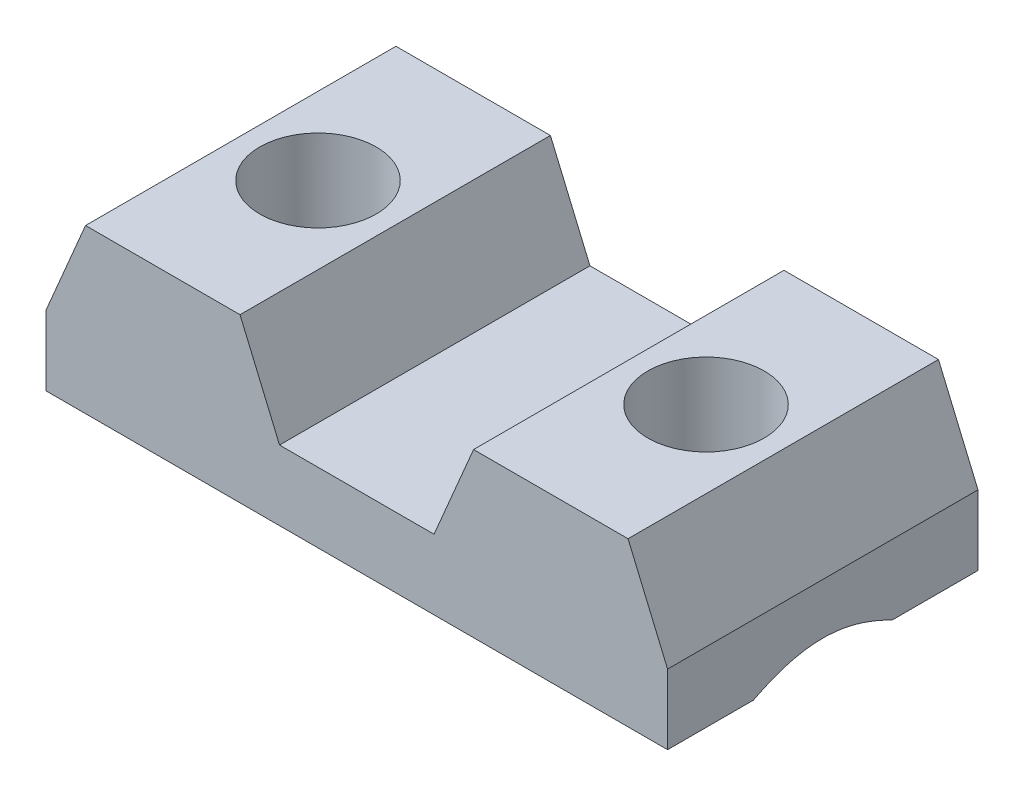
ISO-10303-21;
HEADER;
FILE_DESCRIPTION(('STEP AP214'),'2;1');
FILE_NAME('part.step','',(''),(''),'','','');
FILE_SCHEMA(('AUTOMOTIVE_DESIGN { 1 0 10303 214 1 1 1 1 }'));
ENDSEC;
DATA;
#1=APPLICATION_CONTEXT('core data for automotive mechanical design processes');
#2=APPLICATION_PROTOCOL_DEFINITION('international standard','automotive_design',2000,#1);
#3=PRODUCT_CONTEXT('',#1,'mechanical');
#4=PRODUCT('Part','Part','',(#3));
#5=PRODUCT_RELATED_PRODUCT_CATEGORY('part','',(#4));
#6=PRODUCT_DEFINITION_FORMATION('','',#4);
#7=PRODUCT_DEFINITION_CONTEXT('part definition',#1,'design');
#8=PRODUCT_DEFINITION('design','',#6,#7);
#9=PRODUCT_DEFINITION_SHAPE('','',#8);
#10=(LENGTH_UNIT() NAMED_UNIT(*) SI_UNIT(.MILLI.,.METRE.));
#11=(NAMED_UNIT(*) PLANE_ANGLE_UNIT() SI_UNIT($,.RADIAN.));
#12=(NAMED_UNIT(*) SI_UNIT($,.STERADIAN.) SOLID_ANGLE_UNIT());
#13=UNCERTAINTY_MEASURE_WITH_UNIT(LENGTH_MEASURE(1.E-05),#10,'distance_accuracy_value','');
#14=(GEOMETRIC_REPRESENTATION_CONTEXT(3) GLOBAL_UNCERTAINTY_ASSIGNED_CONTEXT((#13)) GLOBAL_UNIT_ASSIGNED_CONTEXT((#10,
#11,#12)) REPRESENTATION_CONTEXT('',''));
#15=CARTESIAN_POINT('',(0.,0.,0.));
#16=DIRECTION('',(0.,0.,1.));
#17=DIRECTION('',(1.,0.,0.));
#18=AXIS2_PLACEMENT_3D('',#15,#16,#17);
#19=CARTESIAN_POINT('',(6.99063022054847,0.,8.));
#20=DIRECTION('',(-0.92050485345244,-0.390731128489275,0.));
#21=DIRECTION('',(0.390731128489275,-0.92050485345244,0.));
#22=AXIS2_PLACEMENT_3D('',#19,#20,#21);
#23=PLANE('',#22);
#24=DIRECTION('',(-0.390731128489275,0.92050485345244,0.));
#25=VECTOR('',#24,1.);
#26=CARTESIAN_POINT('',(6.99063022054847,0.,0.));
#27=LINE('',#26,#25);
#28=CARTESIAN_POINT('',(8.00936977945153,-2.4,0.));
#29=VERTEX_POINT('',#28);
#30=CARTESIAN_POINT('',(6.99063022054847,0.,0.));
#31=VERTEX_POINT('',#30);
#32=EDGE_CURVE('E146',#29,#31,#27,.T.);
#33=ORIENTED_EDGE('',*,*,#32,.T.);
#34=DIRECTION('',(0.,0.,-1.));
#35=VECTOR('',#34,1.);
#36=CARTESIAN_POINT('',(6.99063022054847,0.,8.));
#37=LINE('',#36,#35);
#38=CARTESIAN_POINT('',(6.99063022054847,0.,8.));
#39=VERTEX_POINT('',#38);
#40=EDGE_CURVE('E127',#39,#31,#37,.T.);
#41=ORIENTED_EDGE('',*,*,#40,.F.);
#42=DIRECTION('',(-0.390731128489275,0.92050485345244,0.));
#43=VECTOR('',#42,1.);
#44=CARTESIAN_POINT('',(6.99063022054847,0.,8.));
#45=LINE('',#44,#43);
#46=CARTESIAN_POINT('',(8.00936977945153,-2.4,8.));
#47=VERTEX_POINT('',#46);
#48=EDGE_CURVE('E134',#47,#39,#45,.T.);
#49=ORIENTED_EDGE('',*,*,#48,.F.);
#50=DIRECTION('',(0.,0.,-1.));
#51=VECTOR('',#50,1.);
#52=CARTESIAN_POINT('',(8.00936977945153,-2.4,8.));
#53=LINE('',#52,#51);
#54=EDGE_CURVE('E330',#47,#29,#53,.T.);
#55=ORIENTED_EDGE('',*,*,#54,.T.);
#56=EDGE_LOOP('',(#33,#41,#49,#55));
#57=FACE_BOUND('',#56,.T.);
#58=ADVANCED_FACE('F33',(#57),#23,.F.);
#59=CARTESIAN_POINT('',(6.99063022054847,0.,8.));
#60=DIRECTION('',(0.,-1.,0.));
#61=DIRECTION('',(1.,0.,0.));
#62=AXIS2_PLACEMENT_3D('',#59,#60,#61);
#63=PLANE('',#62);
#64=CARTESIAN_POINT('',(5.,0.,4.));
#65=DIRECTION('',(0.,1.,0.));
#66=DIRECTION('',(-1.,0.,0.));
#67=AXIS2_PLACEMENT_3D('',#64,#65,#66);
#68=CIRCLE('',#67,1.5);
#69=CARTESIAN_POINT('',(3.5,0.,4.));
#70=VERTEX_POINT('',#69);
#71=EDGE_CURVE('E376',#70,#70,#68,.T.);
#72=ORIENTED_EDGE('',*,*,#71,.F.);
#73=EDGE_LOOP('',(#72));
#74=FACE_BOUND('',#73,.T.);
#75=DIRECTION('',(-1.,0.,0.));
#76=VECTOR('',#75,1.);
#77=CARTESIAN_POINT('',(6.99063022054847,0.,0.));
#78=LINE('',#77,#76);
#79=CARTESIAN_POINT('',(3.00936977945153,0.,0.));
#80=VERTEX_POINT('',#79);
#81=EDGE_CURVE('E360',#31,#80,#78,.T.);
#82=ORIENTED_EDGE('',*,*,#81,.T.);
#83=DIRECTION('',(0.,0.,-1.));
#84=VECTOR('',#83,1.);
#85=CARTESIAN_POINT('',(3.00936977945153,0.,8.));
#86=LINE('',#85,#84);
#87=CARTESIAN_POINT('',(3.00936977945153,0.,8.));
#88=VERTEX_POINT('',#87);
#89=EDGE_CURVE('E130',#88,#80,#86,.T.);
#90=ORIENTED_EDGE('',*,*,#89,.F.);
#91=DIRECTION('',(-1.,0.,0.));
#92=VECTOR('',#91,1.);
#93=CARTESIAN_POINT('',(6.99063022054847,0.,8.));
#94=LINE('',#93,#92);
#95=EDGE_CURVE('E123',#39,#88,#94,.T.);
#96=ORIENTED_EDGE('',*,*,#95,.F.);
#97=ORIENTED_EDGE('',*,*,#40,.T.);
#98=EDGE_LOOP('',(#82,#90,#96,#97));
#99=FACE_BOUND('',#98,.T.);
#100=ADVANCED_FACE('F125',(#74,#99),#63,.F.);
#101=CARTESIAN_POINT('',(3.00936977945153,0.,8.));
#102=DIRECTION('',(0.92050485345244,-0.390731128489275,0.));
#103=DIRECTION('',(0.390731128489275,0.92050485345244,0.));
#104=AXIS2_PLACEMENT_3D('',#101,#102,#103);
#105=PLANE('',#104);
#106=DIRECTION('',(-0.390731128489275,-0.92050485345244,0.));
#107=VECTOR('',#106,1.);
#108=CARTESIAN_POINT('',(3.00936977945153,0.,0.));
#109=LINE('',#108,#107);
#110=CARTESIAN_POINT('',(1.99063022054847,-2.4,0.));
#111=VERTEX_POINT('',#110);
#112=EDGE_CURVE('E354',#80,#111,#109,.T.);
#113=ORIENTED_EDGE('',*,*,#112,.T.);
#114=DIRECTION('',(0.,0.,-1.));
#115=VECTOR('',#114,1.);
#116=CARTESIAN_POINT('',(1.99063022054847,-2.4,8.));
#117=LINE('',#116,#115);
#118=CARTESIAN_POINT('',(1.99063022054847,-2.4,8.));
#119=VERTEX_POINT('',#118);
#120=EDGE_CURVE('E152',#119,#111,#117,.T.);
#121=ORIENTED_EDGE('',*,*,#120,.F.);
#122=DIRECTION('',(-0.390731128489275,-0.92050485345244,0.));
#123=VECTOR('',#122,1.);
#124=CARTESIAN_POINT('',(3.00936977945153,0.,8.));
#125=LINE('',#124,#123);
#126=EDGE_CURVE('E133',#88,#119,#125,.T.);
#127=ORIENTED_EDGE('',*,*,#126,.F.);
#128=ORIENTED_EDGE('',*,*,#89,.T.);
#129=EDGE_LOOP('',(#113,#121,#127,#128));
#130=FACE_BOUND('',#129,.T.);
#131=ADVANCED_FACE('F189',(#130),#105,.F.);
#132=CARTESIAN_POINT('',(-1.99063022054847,-2.4,8.));
#133=DIRECTION('',(0.,-1.,0.));
#134=DIRECTION('',(0.,0.,-1.));
#135=AXIS2_PLACEMENT_3D('',#132,#133,#134);
#136=PLANE('',#135);
#137=DIRECTION('',(-1.,0.,0.));
#138=VECTOR('',#137,1.);
#139=CARTESIAN_POINT('',(-1.99063022054847,-2.4,0.));
#140=LINE('',#139,#138);
#141=CARTESIAN_POINT('',(-1.99063022054847,-2.4,0.));
#142=VERTEX_POINT('',#141);
#143=EDGE_CURVE('E350',#111,#142,#140,.T.);
#144=ORIENTED_EDGE('',*,*,#143,.T.);
#145=DIRECTION('',(0.,0.,-1.));
#146=VECTOR('',#145,1.);
#147=CARTESIAN_POINT('',(-1.99063022054847,-2.4,8.));
#148=LINE('',#147,#146);
#149=CARTESIAN_POINT('',(-1.99063022054847,-2.4,8.));
#150=VERTEX_POINT('',#149);
#151=EDGE_CURVE('E343',#150,#142,#148,.T.);
#152=ORIENTED_EDGE('',*,*,#151,.F.);
#153=DIRECTION('',(-1.,0.,0.));
#154=VECTOR('',#153,1.);
#155=CARTESIAN_POINT('',(-1.99063022054847,-2.4,8.));
#156=LINE('',#155,#154);
#157=EDGE_CURVE('E351',#119,#150,#156,.T.);
#158=ORIENTED_EDGE('',*,*,#157,.F.);
#159=ORIENTED_EDGE('',*,*,#120,.T.);
#160=EDGE_LOOP('',(#144,#152,#158,#159));
#161=FACE_BOUND('',#160,.T.);
#162=ADVANCED_FACE('F185',(#161),#136,.F.);
#163=CARTESIAN_POINT('',(-3.00936977945153,0.,8.));
#164=DIRECTION('',(-0.92050485345244,-0.390731128489275,0.));
#165=DIRECTION('',(0.390731128489275,-0.92050485345244,0.));
#166=AXIS2_PLACEMENT_3D('',#163,#164,#165);
#167=PLANE('',#166);
#168=DIRECTION('',(-0.390731128489275,0.92050485345244,0.));
#169=VECTOR('',#168,1.);
#170=CARTESIAN_POINT('',(-3.00936977945153,0.,0.));
#171=LINE('',#170,#169);
#172=CARTESIAN_POINT('',(-3.00936977945153,0.,0.));
#173=VERTEX_POINT('',#172);
#174=EDGE_CURVE('E356',#142,#173,#171,.T.);
#175=ORIENTED_EDGE('',*,*,#174,.T.);
#176=DIRECTION('',(0.,0.,-1.));
#177=VECTOR('',#176,1.);
#178=CARTESIAN_POINT('',(-3.00936977945153,0.,8.));
#179=LINE('',#178,#177);
#180=CARTESIAN_POINT('',(-3.00936977945153,0.,8.));
#181=VERTEX_POINT('',#180);
#182=EDGE_CURVE('E340',#181,#173,#179,.T.);
#183=ORIENTED_EDGE('',*,*,#182,.F.);
#184=DIRECTION('',(-0.390731128489275,0.92050485345244,0.));
#185=VECTOR('',#184,1.);
#186=CARTESIAN_POINT('',(-3.00936977945153,0.,8.));
#187=LINE('',#186,#185);
#188=EDGE_CURVE('E388',#150,#181,#187,.T.);
#189=ORIENTED_EDGE('',*,*,#188,.F.);
#190=ORIENTED_EDGE('',*,*,#151,.T.);
#191=EDGE_LOOP('',(#175,#183,#189,#190));
#192=FACE_BOUND('',#191,.T.);
#193=ADVANCED_FACE('F181',(#192),#167,.F.);
#194=CARTESIAN_POINT('',(-6.99063022054847,0.,8.));
#195=DIRECTION('',(0.,-1.,0.));
#196=DIRECTION('',(1.,0.,0.));
#197=AXIS2_PLACEMENT_3D('',#194,#195,#196);
#198=PLANE('',#197);
#199=CARTESIAN_POINT('',(-5.,0.,4.));
#200=DIRECTION('',(0.,1.,0.));
#201=DIRECTION('',(-1.,0.,0.));
#202=AXIS2_PLACEMENT_3D('',#199,#200,#201);
#203=CIRCLE('',#202,1.5);
#204=CARTESIAN_POINT('',(-6.5,0.,4.));
#205=VERTEX_POINT('',#204);
#206=EDGE_CURVE('E373',#205,#205,#203,.T.);
#207=ORIENTED_EDGE('',*,*,#206,.F.);
#208=EDGE_LOOP('',(#207));
#209=FACE_BOUND('',#208,.T.);
#210=DIRECTION('',(-1.,0.,0.));
#211=VECTOR('',#210,1.);
#212=CARTESIAN_POINT('',(-6.99063022054847,0.,0.));
#213=LINE('',#212,#211);
#214=CARTESIAN_POINT('',(-6.99063022054847,0.,0.));
#215=VERTEX_POINT('',#214);
#216=EDGE_CURVE('E358',#173,#215,#213,.T.);
#217=ORIENTED_EDGE('',*,*,#216,.T.);
#218=DIRECTION('',(0.,0.,-1.));
#219=VECTOR('',#218,1.);
#220=CARTESIAN_POINT('',(-6.99063022054847,0.,8.));
#221=LINE('',#220,#219);
#222=CARTESIAN_POINT('',(-6.99063022054847,0.,8.));
#223=VERTEX_POINT('',#222);
#224=EDGE_CURVE('E337',#223,#215,#221,.T.);
#225=ORIENTED_EDGE('',*,*,#224,.F.);
#226=DIRECTION('',(-1.,0.,0.));
#227=VECTOR('',#226,1.);
#228=CARTESIAN_POINT('',(-6.99063022054847,0.,8.));
#229=LINE('',#228,#227);
#230=EDGE_CURVE('E386',#181,#223,#229,.T.);
#231=ORIENTED_EDGE('',*,*,#230,.F.);
#232=ORIENTED_EDGE('',*,*,#182,.T.);
#233=EDGE_LOOP('',(#217,#225,#231,#232));
#234=FACE_BOUND('',#233,.T.);
#235=ADVANCED_FACE('F177',(#209,#234),#198,.F.);
#236=CARTESIAN_POINT('',(-6.99063022054847,0.,8.));
#237=DIRECTION('',(0.92050485345244,-0.390731128489275,0.));
#238=DIRECTION('',(0.390731128489275,0.92050485345244,0.));
#239=AXIS2_PLACEMENT_3D('',#236,#237,#238);
#240=PLANE('',#239);
#241=DIRECTION('',(-0.390731128489275,-0.92050485345244,0.));
#242=VECTOR('',#241,1.);
#243=CARTESIAN_POINT('',(-6.99063022054847,0.,0.));
#244=LINE('',#243,#242);
#245=CARTESIAN_POINT('',(-8.00936977945153,-2.4,0.));
#246=VERTEX_POINT('',#245);
#247=EDGE_CURVE('E365',#215,#246,#244,.T.);
#248=ORIENTED_EDGE('',*,*,#247,.T.);
#249=DIRECTION('',(0.,0.,-1.));
#250=VECTOR('',#249,1.);
#251=CARTESIAN_POINT('',(-8.00936977945153,-2.4,8.));
#252=LINE('',#251,#250);
#253=CARTESIAN_POINT('',(-8.00936977945153,-2.4,8.));
#254=VERTEX_POINT('',#253);
#255=EDGE_CURVE('E334',#254,#246,#252,.T.);
#256=ORIENTED_EDGE('',*,*,#255,.F.);
#257=DIRECTION('',(-0.390731128489275,-0.92050485345244,0.));
#258=VECTOR('',#257,1.);
#259=CARTESIAN_POINT('',(-6.99063022054847,0.,8.));
#260=LINE('',#259,#258);
#261=EDGE_CURVE('E384',#223,#254,#260,.T.);
#262=ORIENTED_EDGE('',*,*,#261,.F.);
#263=ORIENTED_EDGE('',*,*,#224,.T.);
#264=EDGE_LOOP('',(#248,#256,#262,#263));
#265=FACE_BOUND('',#264,.T.);
#266=ADVANCED_FACE('F173',(#265),#240,.F.);
#267=CARTESIAN_POINT('',(-8.00936977945153,-2.4,8.));
#268=DIRECTION('',(1.,0.,0.));
#269=DIRECTION('',(0.,0.,-1.));
#270=AXIS2_PLACEMENT_3D('',#267,#268,#269);
#271=PLANE('',#270);
#272=DIRECTION('',(0.,0.,-1.));
#273=VECTOR('',#272,1.);
#274=CARTESIAN_POINT('',(-8.00936977945153,-4.2,8.));
#275=LINE('',#274,#273);
#276=CARTESIAN_POINT('',(-8.00936977945153,-4.2,2.21290919913849));
#277=VERTEX_POINT('',#276);
#278=CARTESIAN_POINT('',(-8.00936977945153,-4.2,0.));
#279=VERTEX_POINT('',#278);
#280=EDGE_CURVE('E326',#277,#279,#275,.T.);
#281=ORIENTED_EDGE('',*,*,#280,.F.);
#282=CARTESIAN_POINT('',(-8.00936977945153,-4.2,2.21290919913849));
#283=CARTESIAN_POINT('',(-8.00936977945153,-4.16871578945284,2.27419074035915));
#284=CARTESIAN_POINT('',(-8.00936977945153,-4.13836625380984,2.33594847393503));
#285=CARTESIAN_POINT('',(-8.00936977945153,-4.07983181141081,2.46052237973463));
#286=CARTESIAN_POINT('',(-8.00936977945153,-4.05164814874477,2.52333913537894));
#287=CARTESIAN_POINT('',(-8.00936977945153,-3.97052428689372,2.71417802832816));
#288=CARTESIAN_POINT('',(-8.00936977945153,-3.92138752017952,2.84386819249786));
#289=CARTESIAN_POINT('',(-8.00936977945153,-3.83713592617526,3.10537588465967));
#290=CARTESIAN_POINT('',(-8.00936977945153,-3.80179696949844,3.23711978979554));
#291=CARTESIAN_POINT('',(-8.00936977945153,-3.74725542080623,3.50366615939376));
#292=CARTESIAN_POINT('',(-8.00936977945153,-3.72800885781087,3.63845924895136));
#293=CARTESIAN_POINT('',(-8.00936977945153,-3.71077428234083,3.86826941194748));
#294=CARTESIAN_POINT('',(-8.00936977945153,-3.70810906884971,3.96295085378222));
#295=CARTESIAN_POINT('',(-8.00936977945153,-3.71173162083696,4.15218403606616));
#296=CARTESIAN_POINT('',(-8.00936977945153,-3.71802265899547,4.24673571646074));
#297=CARTESIAN_POINT('',(-8.00936977945153,-3.73920010439786,4.4349693278625));
#298=CARTESIAN_POINT('',(-8.00936977945153,-3.7540970671054,4.52865004697143));
#299=CARTESIAN_POINT('',(-8.00936977945153,-3.79166769487479,4.71441014110962));
#300=CARTESIAN_POINT('',(-8.00936977945153,-3.81434079415145,4.8064896321309));
#301=CARTESIAN_POINT('',(-8.00936977945153,-3.86242127288549,4.97471587849637));
#302=CARTESIAN_POINT('',(-8.00936977945153,-3.88687562102531,5.05113986599515));
#303=CARTESIAN_POINT('',(-8.00936977945153,-3.93996115709255,5.20252494823962));
#304=CARTESIAN_POINT('',(-8.00936977945153,-3.96859280917031,5.27748587937082));
#305=CARTESIAN_POINT('',(-8.00936977945153,-4.0293268441301,5.42571923174706));
#306=CARTESIAN_POINT('',(-8.00936977945153,-4.06141884098988,5.49899594682528));
#307=CARTESIAN_POINT('',(-8.00936977945153,-4.12859340955563,5.64409815306972));
#308=CARTESIAN_POINT('',(-8.00936977945153,-4.16367356629317,5.71592475918171));
#309=CARTESIAN_POINT('',(-8.00936977945153,-4.2,5.78709080086151));
#310=B_SPLINE_CURVE_WITH_KNOTS('',3,(#282,#283,#284,#285,#286,#287,#288,#289,#290,#291,#292,
#293,#294,#295,#296,#297,#298,#299,#300,#301,#302,#303,#304,#305,#306,#307,#308,#309),
.UNSPECIFIED.,.F.,.F.,(4,2,2,2,2,2,2,2,2,2,2,2,2,4),(0.,0.206399371443589,0.412916427220919,
0.828383439136866,1.23678896019127,1.64407486985018,1.92783134122069,2.2116915259072,
2.49590061635695,2.78008903237592,3.02068120509467,3.26130013098036,3.5012159625855,
3.74093970617943),.UNSPECIFIED.);
#311=CARTESIAN_POINT('',(-8.00936977945153,-4.2,5.78709080086151));
#312=VERTEX_POINT('',#311);
#313=EDGE_CURVE('E48',#277,#312,#310,.T.);
#314=ORIENTED_EDGE('',*,*,#313,.T.);
#315=CARTESIAN_POINT('',(-8.00936977945153,-4.2,8.));
#316=VERTEX_POINT('',#315);
#317=EDGE_CURVE('E328',#316,#312,#275,.T.);
#318=ORIENTED_EDGE('',*,*,#317,.F.);
#319=DIRECTION('',(0.,-1.,0.));
#320=VECTOR('',#319,1.);
#321=CARTESIAN_POINT('',(-8.00936977945153,-2.4,8.));
#322=LINE('',#321,#320);
#323=EDGE_CURVE('E382',#254,#316,#322,.T.);
#324=ORIENTED_EDGE('',*,*,#323,.F.);
#325=ORIENTED_EDGE('',*,*,#255,.T.);
#326=DIRECTION('',(0.,-1.,0.));
#327=VECTOR('',#326,1.);
#328=CARTESIAN_POINT('',(-8.00936977945153,-2.4,0.));
#329=LINE('',#328,#327);
#330=EDGE_CURVE('E367',#246,#279,#329,.T.);
#331=ORIENTED_EDGE('',*,*,#330,.T.);
#332=EDGE_LOOP('',(#281,#314,#318,#324,#325,#331));
#333=FACE_BOUND('',#332,.T.);
#334=ADVANCED_FACE('F167',(#333),#271,.F.);
#335=CARTESIAN_POINT('',(-8.00936977945153,-4.2,8.));
#336=DIRECTION('',(0.,1.,0.));
#337=DIRECTION('',(-1.,0.,0.));
#338=AXIS2_PLACEMENT_3D('',#335,#336,#337);
#339=PLANE('',#338);
#340=ORIENTED_EDGE('',*,*,#317,.T.);
#341=CARTESIAN_POINT('',(-5.,-4.2,4.));
#342=DIRECTION('',(0.,1.,0.));
#343=DIRECTION('',(-1.,0.,0.));
#344=AXIS2_PLACEMENT_3D('',#341,#342,#343);
#345=CIRCLE('',#344,3.5);
#346=EDGE_CURVE('E150',#312,#277,#345,.T.);
#347=ORIENTED_EDGE('',*,*,#346,.T.);
#348=ORIENTED_EDGE('',*,*,#280,.T.);
#349=DIRECTION('',(1.,0.,0.));
#350=VECTOR('',#349,1.);
#351=CARTESIAN_POINT('',(-8.00936977945153,-4.2,0.));
#352=LINE('',#351,#350);
#353=CARTESIAN_POINT('',(8.00936977945153,-4.2,0.));
#354=VERTEX_POINT('',#353);
#355=EDGE_CURVE('E370',#279,#354,#352,.T.);
#356=ORIENTED_EDGE('',*,*,#355,.T.);
#357=DIRECTION('',(0.,0.,-1.));
#358=VECTOR('',#357,1.);
#359=CARTESIAN_POINT('',(8.00936977945153,-4.2,8.));
#360=LINE('',#359,#358);
#361=CARTESIAN_POINT('',(8.00936977945153,-4.2,2.21290919913841));
#362=VERTEX_POINT('',#361);
#363=EDGE_CURVE('E325',#362,#354,#360,.T.);
#364=ORIENTED_EDGE('',*,*,#363,.F.);
#365=CARTESIAN_POINT('',(5.,-4.2,4.));
#366=DIRECTION('',(0.,1.,0.));
#367=DIRECTION('',(-1.,0.,0.));
#368=AXIS2_PLACEMENT_3D('',#365,#366,#367);
#369=CIRCLE('',#368,3.50000000000004);
#370=CARTESIAN_POINT('',(8.00936977945153,-4.2,5.78709080086159));
#371=VERTEX_POINT('',#370);
#372=EDGE_CURVE('E147',#362,#371,#369,.T.);
#373=ORIENTED_EDGE('',*,*,#372,.T.);
#374=CARTESIAN_POINT('',(8.00936977945153,-4.2,8.));
#375=VERTEX_POINT('',#374);
#376=EDGE_CURVE('E323',#375,#371,#360,.T.);
#377=ORIENTED_EDGE('',*,*,#376,.F.);
#378=DIRECTION('',(1.,0.,0.));
#379=VECTOR('',#378,1.);
#380=CARTESIAN_POINT('',(-8.00936977945153,-4.2,8.));
#381=LINE('',#380,#379);
#382=EDGE_CURVE('E380',#316,#375,#381,.T.);
#383=ORIENTED_EDGE('',*,*,#382,.F.);
#384=EDGE_LOOP('',(#340,#347,#348,#356,#364,#373,#377,#383));
#385=FACE_BOUND('',#384,.T.);
#386=ADVANCED_FACE('F172',(#385),#339,.F.);
#387=CARTESIAN_POINT('',(8.00936977945153,-4.2,8.));
#388=DIRECTION('',(-1.,0.,0.));
#389=DIRECTION('',(0.,-1.,0.));
#390=AXIS2_PLACEMENT_3D('',#387,#388,#389);
#391=PLANE('',#390);
#392=ORIENTED_EDGE('',*,*,#376,.T.);
#393=CARTESIAN_POINT('',(8.00936977945153,-4.2,5.78709080086159));
#394=CARTESIAN_POINT('',(8.00936977945153,-4.16871578945284,5.72580925964092));
#395=CARTESIAN_POINT('',(8.00936977945153,-4.13836625380983,5.66405152606504));
#396=CARTESIAN_POINT('',(8.00936977945153,-4.0798318114108,5.53947762026543));
#397=CARTESIAN_POINT('',(8.00936977945153,-4.05164814874476,5.47666086462112));
#398=CARTESIAN_POINT('',(8.00936977945153,-3.97052428689371,5.28582197167189));
#399=CARTESIAN_POINT('',(8.00936977945153,-3.9213875201795,5.15613180750218));
#400=CARTESIAN_POINT('',(8.00936977945153,-3.83713592617523,4.89462411534036));
#401=CARTESIAN_POINT('',(8.00936977945153,-3.80179696949842,4.76288021020449));
#402=CARTESIAN_POINT('',(8.00936977945153,-3.7472554208062,4.49633384060624));
#403=CARTESIAN_POINT('',(8.00936977945153,-3.72800885781084,4.36154075104864));
#404=CARTESIAN_POINT('',(8.00936977945153,-3.71077428234079,4.13173058805251));
#405=CARTESIAN_POINT('',(8.00936977945153,-3.70810906884968,4.03704914621776));
#406=CARTESIAN_POINT('',(8.00936977945153,-3.71173162083693,3.84781596393383));
#407=CARTESIAN_POINT('',(8.00936977945153,-3.71802265899544,3.75326428353924));
#408=CARTESIAN_POINT('',(8.00936977945153,-3.73920010439783,3.56503067213748));
#409=CARTESIAN_POINT('',(8.00936977945153,-3.75409706710537,3.47134995302855));
#410=CARTESIAN_POINT('',(8.00936977945153,-3.79166769487477,3.28558985889035));
#411=CARTESIAN_POINT('',(8.00936977945153,-3.81434079415143,3.19351036786906));
#412=CARTESIAN_POINT('',(8.00936977945153,-3.86242127288547,3.02528412150359));
#413=CARTESIAN_POINT('',(8.00936977945153,-3.88687562102529,2.94886013400481));
#414=CARTESIAN_POINT('',(8.00936977945153,-3.93996115709253,2.79747505176033));
#415=CARTESIAN_POINT('',(8.00936977945153,-3.9685928091703,2.72251412062912));
#416=CARTESIAN_POINT('',(8.00936977945153,-4.02932684413009,2.57428076825288));
#417=CARTESIAN_POINT('',(8.00936977945153,-4.06141884098987,2.50100405317466));
#418=CARTESIAN_POINT('',(8.00936977945153,-4.12859340955562,2.35590184693021));
#419=CARTESIAN_POINT('',(8.00936977945153,-4.16367356629317,2.28407524081822));
#420=CARTESIAN_POINT('',(8.00936977945153,-4.2,2.21290919913841));
#421=B_SPLINE_CURVE_WITH_KNOTS('',3,(#393,#394,#395,#396,#397,#398,#399,#400,#401,#402,#403,
#404,#405,#406,#407,#408,#409,#410,#411,#412,#413,#414,#415,#416,#417,#418,#419,#420),
.UNSPECIFIED.,.F.,.F.,(4,2,2,2,2,2,2,2,2,2,2,2,2,4),(0.,0.206399371443601,0.412916427220942,
0.828383439136912,1.23678896019133,1.64407486985027,1.92783134122079,2.2116915259073,
2.49590061635706,2.78008903237604,3.0206812050948,3.2613001309805,3.50121596258566,
3.7409397061796),.UNSPECIFIED.);
#422=EDGE_CURVE('E42',#371,#362,#421,.T.);
#423=ORIENTED_EDGE('',*,*,#422,.T.);
#424=ORIENTED_EDGE('',*,*,#363,.T.);
#425=DIRECTION('',(0.,1.,0.));
#426=VECTOR('',#425,1.);
#427=CARTESIAN_POINT('',(8.00936977945153,-4.2,0.));
#428=LINE('',#427,#426);
#429=EDGE_CURVE('E143',#354,#29,#428,.T.);
#430=ORIENTED_EDGE('',*,*,#429,.T.);
#431=ORIENTED_EDGE('',*,*,#54,.F.);
#432=DIRECTION('',(0.,1.,0.));
#433=VECTOR('',#432,1.);
#434=CARTESIAN_POINT('',(8.00936977945153,-4.2,8.));
#435=LINE('',#434,#433);
#436=EDGE_CURVE('E139',#375,#47,#435,.T.);
#437=ORIENTED_EDGE('',*,*,#436,.F.);
#438=EDGE_LOOP('',(#392,#423,#424,#430,#431,#437));
#439=FACE_BOUND('',#438,.T.);
#440=ADVANCED_FACE('F235',(#439),#391,.F.);
#441=CARTESIAN_POINT('',(0.,0.,8.));
#442=DIRECTION('',(0.,0.,1.));
#443=DIRECTION('',(1.,0.,0.));
#444=AXIS2_PLACEMENT_3D('',#441,#442,#443);
#445=PLANE('',#444);
#446=ORIENTED_EDGE('',*,*,#48,.T.);
#447=ORIENTED_EDGE('',*,*,#95,.T.);
#448=ORIENTED_EDGE('',*,*,#126,.T.);
#449=ORIENTED_EDGE('',*,*,#157,.T.);
#450=ORIENTED_EDGE('',*,*,#188,.T.);
#451=ORIENTED_EDGE('',*,*,#230,.T.);
#452=ORIENTED_EDGE('',*,*,#261,.T.);
#453=ORIENTED_EDGE('',*,*,#323,.T.);
#454=ORIENTED_EDGE('',*,*,#382,.T.);
#455=ORIENTED_EDGE('',*,*,#436,.T.);
#456=EDGE_LOOP('',(#446,#447,#448,#449,#450,#451,#452,#453,#454,#455));
#457=FACE_BOUND('',#456,.T.);
#458=ADVANCED_FACE('F137',(#457),#445,.T.);
#459=CARTESIAN_POINT('',(0.,0.,0.));
#460=DIRECTION('',(0.,0.,1.));
#461=DIRECTION('',(1.,0.,0.));
#462=AXIS2_PLACEMENT_3D('',#459,#460,#461);
#463=PLANE('',#462);
#464=ORIENTED_EDGE('',*,*,#32,.F.);
#465=ORIENTED_EDGE('',*,*,#429,.F.);
#466=ORIENTED_EDGE('',*,*,#355,.F.);
#467=ORIENTED_EDGE('',*,*,#330,.F.);
#468=ORIENTED_EDGE('',*,*,#247,.F.);
#469=ORIENTED_EDGE('',*,*,#216,.F.);
#470=ORIENTED_EDGE('',*,*,#174,.F.);
#471=ORIENTED_EDGE('',*,*,#143,.F.);
#472=ORIENTED_EDGE('',*,*,#112,.F.);
#473=ORIENTED_EDGE('',*,*,#81,.F.);
#474=EDGE_LOOP('',(#464,#465,#466,#467,#468,#469,#470,#471,#472,#473));
#475=FACE_BOUND('',#474,.T.);
#476=ADVANCED_FACE('F248',(#475),#463,.F.);
#477=CARTESIAN_POINT('',(5.,-4.2,4.));
#478=DIRECTION('',(0.,1.,0.));
#479=DIRECTION('',(-1.,0.,0.));
#480=AXIS2_PLACEMENT_3D('',#477,#478,#479);
#481=CYLINDRICAL_SURFACE('',#480,1.5);
#482=CARTESIAN_POINT('',(5.,-2.19999999999998,4.));
#483=DIRECTION('',(0.,1.,0.));
#484=DIRECTION('',(0.,0.,1.));
#485=AXIS2_PLACEMENT_3D('',#482,#483,#484);
#486=CIRCLE('',#485,1.5);
#487=CARTESIAN_POINT('',(5.,-2.19999999999998,5.5));
#488=VERTEX_POINT('',#487);
#489=EDGE_CURVE('E11',#488,#488,#486,.F.);
#490=ORIENTED_EDGE('',*,*,#489,.T.);
#491=EDGE_LOOP('',(#490));
#492=FACE_BOUND('',#491,.T.);
#493=ORIENTED_EDGE('',*,*,#71,.T.);
#494=EDGE_LOOP('',(#493));
#495=FACE_BOUND('',#494,.T.);
#496=ADVANCED_FACE('F254',(#492,#495),#481,.F.);
#497=CARTESIAN_POINT('',(-5.,-4.2,4.));
#498=DIRECTION('',(0.,1.,0.));
#499=DIRECTION('',(-1.,0.,0.));
#500=AXIS2_PLACEMENT_3D('',#497,#498,#499);
#501=CYLINDRICAL_SURFACE('',#500,1.5);
#502=CARTESIAN_POINT('',(-5.,-2.19999999999999,4.));
#503=DIRECTION('',(0.,1.,0.));
#504=DIRECTION('',(0.,0.,1.));
#505=AXIS2_PLACEMENT_3D('',#502,#503,#504);
#506=CIRCLE('',#505,1.5);
#507=CARTESIAN_POINT('',(-5.,-2.19999999999999,5.5));
#508=VERTEX_POINT('',#507);
#509=EDGE_CURVE('E163',#508,#508,#506,.F.);
#510=ORIENTED_EDGE('',*,*,#509,.T.);
#511=EDGE_LOOP('',(#510));
#512=FACE_BOUND('',#511,.T.);
#513=ORIENTED_EDGE('',*,*,#206,.T.);
#514=EDGE_LOOP('',(#513));
#515=FACE_BOUND('',#514,.T.);
#516=ADVANCED_FACE('F261',(#512,#515),#501,.F.);
#517=CARTESIAN_POINT('',(-5.,-4.2,4.));
#518=DIRECTION('',(0.,-1.,0.));
#519=DIRECTION('',(0.,0.,-1.));
#520=AXIS2_PLACEMENT_3D('',#517,#518,#519);
#521=CONICAL_SURFACE('',#520,3.5,0.785398163397447);
#522=ORIENTED_EDGE('',*,*,#509,.F.);
#523=EDGE_LOOP('',(#522));
#524=FACE_BOUND('',#523,.T.);
#525=ORIENTED_EDGE('',*,*,#313,.F.);
#526=ORIENTED_EDGE('',*,*,#346,.F.);
#527=EDGE_LOOP('',(#525,#526));
#528=FACE_BOUND('',#527,.T.);
#529=ADVANCED_FACE('F164',(#524,#528),#521,.F.);
#530=CARTESIAN_POINT('',(5.,-4.2,4.));
#531=DIRECTION('',(0.,-1.,0.));
#532=DIRECTION('',(0.,0.,-1.));
#533=AXIS2_PLACEMENT_3D('',#530,#531,#532);
#534=CONICAL_SURFACE('',#533,3.50000000000004,0.785398163397454);
#535=ORIENTED_EDGE('',*,*,#489,.F.);
#536=EDGE_LOOP('',(#535));
#537=FACE_BOUND('',#536,.T.);
#538=ORIENTED_EDGE('',*,*,#422,.F.);
#539=ORIENTED_EDGE('',*,*,#372,.F.);
#540=EDGE_LOOP('',(#538,#539));
#541=FACE_BOUND('',#540,.T.);
#542=ADVANCED_FACE('F35',(#537,#541),#534,.F.);
#543=CLOSED_SHELL('',(#58,#100,#131,#162,#193,#235,#266,#334,#386,#440,#458,#476,#496,#516,#529,#542));
#544=MANIFOLD_SOLID_BREP('B2',#543);
#545=ADVANCED_BREP_SHAPE_REPRESENTATION('',(#18,#544),#14);
#546=SHAPE_DEFINITION_REPRESENTATION(#9,#545);
ENDSEC;
END-ISO-10303-21;
